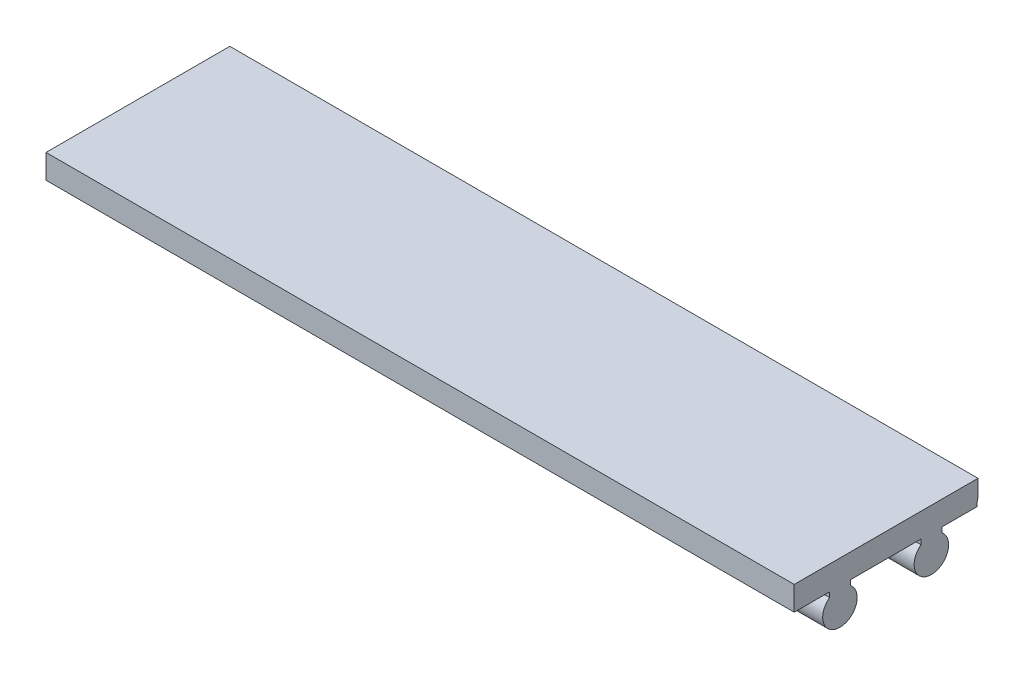
ISO-10303-21;
HEADER;
FILE_DESCRIPTION(('STEP AP214'),'2;1');
FILE_NAME('part.step','',(''),(''),'','','');
FILE_SCHEMA(('AUTOMOTIVE_DESIGN { 1 0 10303 214 1 1 1 1 }'));
ENDSEC;
DATA;
#1=APPLICATION_CONTEXT('core data for automotive mechanical design processes');
#2=APPLICATION_PROTOCOL_DEFINITION('international standard','automotive_design',2000,#1);
#3=PRODUCT_CONTEXT('',#1,'mechanical');
#4=PRODUCT('Part','Part','',(#3));
#5=PRODUCT_RELATED_PRODUCT_CATEGORY('part','',(#4));
#6=PRODUCT_DEFINITION_FORMATION('','',#4);
#7=PRODUCT_DEFINITION_CONTEXT('part definition',#1,'design');
#8=PRODUCT_DEFINITION('design','',#6,#7);
#9=PRODUCT_DEFINITION_SHAPE('','',#8);
#10=(LENGTH_UNIT() NAMED_UNIT(*) SI_UNIT(.MILLI.,.METRE.));
#11=(NAMED_UNIT(*) PLANE_ANGLE_UNIT() SI_UNIT($,.RADIAN.));
#12=(NAMED_UNIT(*) SI_UNIT($,.STERADIAN.) SOLID_ANGLE_UNIT());
#13=UNCERTAINTY_MEASURE_WITH_UNIT(LENGTH_MEASURE(1.E-05),#10,'distance_accuracy_value','');
#14=(GEOMETRIC_REPRESENTATION_CONTEXT(3) GLOBAL_UNCERTAINTY_ASSIGNED_CONTEXT((#13)) GLOBAL_UNIT_ASSIGNED_CONTEXT((#10,
#11,#12)) REPRESENTATION_CONTEXT('',''));
#15=CARTESIAN_POINT('',(0.,0.,0.));
#16=DIRECTION('',(0.,0.,1.));
#17=DIRECTION('',(1.,0.,0.));
#18=AXIS2_PLACEMENT_3D('',#15,#16,#17);
#19=CARTESIAN_POINT('',(0.,-25.7499999999933,-5.49999999999999));
#20=DIRECTION('',(1.,0.,0.));
#21=DIRECTION('',(0.,0.,-1.));
#22=AXIS2_PLACEMENT_3D('',#19,#20,#21);
#23=PLANE('',#22);
#24=DIRECTION('',(0.,-1.,0.));
#25=VECTOR('',#24,1.);
#26=CARTESIAN_POINT('',(0.,-19.2499999999933,11.));
#27=LINE('',#26,#25);
#28=CARTESIAN_POINT('',(0.,-20.6,11.));
#29=VERTEX_POINT('',#28);
#30=CARTESIAN_POINT('',(0.,-23.4999999999933,11.));
#31=VERTEX_POINT('',#30);
#32=EDGE_CURVE('E189',#29,#31,#27,.T.);
#33=ORIENTED_EDGE('',*,*,#32,.F.);
#34=DIRECTION('',(0.,0.,1.));
#35=VECTOR('',#34,1.);
#36=CARTESIAN_POINT('',(0.,-20.6,-11.1085719680622));
#37=LINE('',#36,#35);
#38=CARTESIAN_POINT('',(0.,-20.6,-11.1085719680622));
#39=VERTEX_POINT('',#38);
#40=EDGE_CURVE('E159',#39,#29,#37,.T.);
#41=ORIENTED_EDGE('',*,*,#40,.F.);
#42=DIRECTION('',(0.,-1.,0.));
#43=VECTOR('',#42,1.);
#44=CARTESIAN_POINT('',(0.,-20.6,-11.1085719680622));
#45=LINE('',#44,#43);
#46=CARTESIAN_POINT('',(0.,-22.6,-11.1085719680622));
#47=VERTEX_POINT('',#46);
#48=EDGE_CURVE('E164',#39,#47,#45,.T.);
#49=ORIENTED_EDGE('',*,*,#48,.T.);
#50=CARTESIAN_POINT('',(0.,-23.25,-13.));
#51=DIRECTION('',(1.,0.,0.));
#52=DIRECTION('',(0.,0.,-1.));
#53=AXIS2_PLACEMENT_3D('',#50,#51,#52);
#54=CIRCLE('',#53,2.);
#55=CARTESIAN_POINT('',(0.,-23.25,-11.));
#56=VERTEX_POINT('',#55);
#57=EDGE_CURVE('E244',#47,#56,#54,.T.);
#58=ORIENTED_EDGE('',*,*,#57,.T.);
#59=DIRECTION('',(0.,1.,0.));
#60=VECTOR('',#59,1.);
#61=CARTESIAN_POINT('',(0.,-23.5,-11.));
#62=LINE('',#61,#60);
#63=CARTESIAN_POINT('',(0.,-23.5,-11.));
#64=VERTEX_POINT('',#63);
#65=EDGE_CURVE('E168',#64,#56,#62,.T.);
#66=ORIENTED_EDGE('',*,*,#65,.F.);
#67=DIRECTION('',(0.,0.,1.));
#68=VECTOR('',#67,1.);
#69=CARTESIAN_POINT('',(0.,-23.5,-14.95));
#70=LINE('',#69,#68);
#71=CARTESIAN_POINT('',(0.,-23.5,-6.74999999999999));
#72=VERTEX_POINT('',#71);
#73=EDGE_CURVE('E177',#64,#72,#70,.T.);
#74=ORIENTED_EDGE('',*,*,#73,.T.);
#75=DIRECTION('',(0.,1.,0.));
#76=VECTOR('',#75,1.);
#77=CARTESIAN_POINT('',(0.,-24.0937617924881,-6.74999999999998));
#78=LINE('',#77,#76);
#79=CARTESIAN_POINT('',(0.,-24.0937617924881,-6.74999999999998));
#80=VERTEX_POINT('',#79);
#81=EDGE_CURVE('E185',#80,#72,#78,.T.);
#82=ORIENTED_EDGE('',*,*,#81,.F.);
#83=CARTESIAN_POINT('',(0.,-25.7499999999933,-5.49999999999999));
#84=DIRECTION('',(1.,0.,0.));
#85=DIRECTION('',(0.,0.,-1.));
#86=AXIS2_PLACEMENT_3D('',#83,#84,#85);
#87=CIRCLE('',#86,2.075);
#88=CARTESIAN_POINT('',(0.,-24.0937617924881,-4.24999999999999));
#89=VERTEX_POINT('',#88);
#90=EDGE_CURVE('E182',#89,#80,#87,.T.);
#91=ORIENTED_EDGE('',*,*,#90,.F.);
#92=DIRECTION('',(0.,-1.,0.));
#93=VECTOR('',#92,1.);
#94=CARTESIAN_POINT('',(0.,-23.4999999999933,-4.24999999999999));
#95=LINE('',#94,#93);
#96=CARTESIAN_POINT('',(0.,-23.4999999999933,-4.24999999999999));
#97=VERTEX_POINT('',#96);
#98=EDGE_CURVE('E206',#97,#89,#95,.T.);
#99=ORIENTED_EDGE('',*,*,#98,.F.);
#100=DIRECTION('',(0.,0.,-1.));
#101=VECTOR('',#100,1.);
#102=CARTESIAN_POINT('',(0.,-23.4999999999933,4.25000000000001));
#103=LINE('',#102,#101);
#104=CARTESIAN_POINT('',(0.,-23.4999999999933,4.25000000000001));
#105=VERTEX_POINT('',#104);
#106=EDGE_CURVE('E203',#105,#97,#103,.T.);
#107=ORIENTED_EDGE('',*,*,#106,.F.);
#108=DIRECTION('',(0.,1.,0.));
#109=VECTOR('',#108,1.);
#110=CARTESIAN_POINT('',(0.,-24.0937617924881,4.25000000000001));
#111=LINE('',#110,#109);
#112=CARTESIAN_POINT('',(0.,-24.0937617924881,4.25000000000001));
#113=VERTEX_POINT('',#112);
#114=EDGE_CURVE('E200',#113,#105,#111,.T.);
#115=ORIENTED_EDGE('',*,*,#114,.F.);
#116=CARTESIAN_POINT('',(0.,-25.7499999999933,5.5));
#117=DIRECTION('',(1.,0.,0.));
#118=DIRECTION('',(0.,0.,-1.));
#119=AXIS2_PLACEMENT_3D('',#116,#117,#118);
#120=CIRCLE('',#119,2.075);
#121=CARTESIAN_POINT('',(0.,-24.0937617924881,6.75));
#122=VERTEX_POINT('',#121);
#123=EDGE_CURVE('E197',#122,#113,#120,.T.);
#124=ORIENTED_EDGE('',*,*,#123,.F.);
#125=DIRECTION('',(0.,-1.,0.));
#126=VECTOR('',#125,1.);
#127=CARTESIAN_POINT('',(0.,-23.4999999999933,6.75));
#128=LINE('',#127,#126);
#129=CARTESIAN_POINT('',(0.,-23.4999999999933,6.75));
#130=VERTEX_POINT('',#129);
#131=EDGE_CURVE('E194',#130,#122,#128,.T.);
#132=ORIENTED_EDGE('',*,*,#131,.F.);
#133=DIRECTION('',(0.,0.,-1.));
#134=VECTOR('',#133,1.);
#135=CARTESIAN_POINT('',(0.,-23.4999999999933,11.));
#136=LINE('',#135,#134);
#137=EDGE_CURVE('E191',#31,#130,#136,.T.);
#138=ORIENTED_EDGE('',*,*,#137,.F.);
#139=EDGE_LOOP('',(#33,#41,#49,#58,#66,#74,#82,#91,#99,#107,#115,#124,#132,#138));
#140=FACE_BOUND('',#139,.T.);
#141=ADVANCED_FACE('F33',(#140),#23,.F.);
#142=CARTESIAN_POINT('',(90.,-25.7499999999933,-5.49999999999999));
#143=DIRECTION('',(1.,0.,0.));
#144=DIRECTION('',(0.,0.,-1.));
#145=AXIS2_PLACEMENT_3D('',#142,#143,#144);
#146=PLANE('',#145);
#147=CARTESIAN_POINT('',(90.,-23.25,-13.));
#148=DIRECTION('',(1.,0.,0.));
#149=DIRECTION('',(0.,0.,-1.));
#150=AXIS2_PLACEMENT_3D('',#147,#148,#149);
#151=CIRCLE('',#150,2.);
#152=CARTESIAN_POINT('',(90.,-23.25,-11.));
#153=VERTEX_POINT('',#152);
#154=CARTESIAN_POINT('',(90.,-22.6,-11.1085719680622));
#155=VERTEX_POINT('',#154);
#156=EDGE_CURVE('E41',#153,#155,#151,.F.);
#157=ORIENTED_EDGE('',*,*,#156,.T.);
#158=DIRECTION('',(0.,-1.,0.));
#159=VECTOR('',#158,1.);
#160=CARTESIAN_POINT('',(90.,-20.6,-11.1085719680622));
#161=LINE('',#160,#159);
#162=CARTESIAN_POINT('',(90.,-20.6,-11.1085719680622));
#163=VERTEX_POINT('',#162);
#164=EDGE_CURVE('E151',#163,#155,#161,.T.);
#165=ORIENTED_EDGE('',*,*,#164,.F.);
#166=DIRECTION('',(0.,0.,-1.));
#167=VECTOR('',#166,1.);
#168=CARTESIAN_POINT('',(90.,-20.6,11.));
#169=LINE('',#168,#167);
#170=CARTESIAN_POINT('',(90.,-20.6,11.));
#171=VERTEX_POINT('',#170);
#172=EDGE_CURVE('E148',#171,#163,#169,.T.);
#173=ORIENTED_EDGE('',*,*,#172,.F.);
#174=DIRECTION('',(0.,-1.,0.));
#175=VECTOR('',#174,1.);
#176=CARTESIAN_POINT('',(90.,-19.2499999999933,11.));
#177=LINE('',#176,#175);
#178=CARTESIAN_POINT('',(90.,-23.4999999999933,11.));
#179=VERTEX_POINT('',#178);
#180=EDGE_CURVE('E134',#171,#179,#177,.T.);
#181=ORIENTED_EDGE('',*,*,#180,.T.);
#182=DIRECTION('',(0.,0.,-1.));
#183=VECTOR('',#182,1.);
#184=CARTESIAN_POINT('',(90.,-23.4999999999933,11.));
#185=LINE('',#184,#183);
#186=CARTESIAN_POINT('',(90.,-23.4999999999933,6.75));
#187=VERTEX_POINT('',#186);
#188=EDGE_CURVE('E144',#179,#187,#185,.T.);
#189=ORIENTED_EDGE('',*,*,#188,.T.);
#190=DIRECTION('',(0.,-1.,0.));
#191=VECTOR('',#190,1.);
#192=CARTESIAN_POINT('',(90.,-23.4999999999933,6.75));
#193=LINE('',#192,#191);
#194=CARTESIAN_POINT('',(90.,-24.0937617924881,6.75));
#195=VERTEX_POINT('',#194);
#196=EDGE_CURVE('E215',#187,#195,#193,.T.);
#197=ORIENTED_EDGE('',*,*,#196,.T.);
#198=CARTESIAN_POINT('',(90.,-25.7499999999933,5.5));
#199=DIRECTION('',(1.,0.,0.));
#200=DIRECTION('',(0.,0.,-1.));
#201=AXIS2_PLACEMENT_3D('',#198,#199,#200);
#202=CIRCLE('',#201,2.075);
#203=CARTESIAN_POINT('',(90.,-24.0937617924881,4.25000000000001));
#204=VERTEX_POINT('',#203);
#205=EDGE_CURVE('E218',#195,#204,#202,.T.);
#206=ORIENTED_EDGE('',*,*,#205,.T.);
#207=DIRECTION('',(0.,1.,0.));
#208=VECTOR('',#207,1.);
#209=CARTESIAN_POINT('',(90.,-24.0937617924881,4.25000000000001));
#210=LINE('',#209,#208);
#211=CARTESIAN_POINT('',(90.,-23.4999999999933,4.25000000000001));
#212=VERTEX_POINT('',#211);
#213=EDGE_CURVE('E221',#204,#212,#210,.T.);
#214=ORIENTED_EDGE('',*,*,#213,.T.);
#215=DIRECTION('',(0.,0.,-1.));
#216=VECTOR('',#215,1.);
#217=CARTESIAN_POINT('',(90.,-23.4999999999933,4.25000000000001));
#218=LINE('',#217,#216);
#219=CARTESIAN_POINT('',(90.,-23.4999999999933,-4.24999999999999));
#220=VERTEX_POINT('',#219);
#221=EDGE_CURVE('E224',#212,#220,#218,.T.);
#222=ORIENTED_EDGE('',*,*,#221,.T.);
#223=DIRECTION('',(0.,-1.,0.));
#224=VECTOR('',#223,1.);
#225=CARTESIAN_POINT('',(90.,-23.4999999999933,-4.24999999999999));
#226=LINE('',#225,#224);
#227=CARTESIAN_POINT('',(90.,-24.0937617924881,-4.24999999999999));
#228=VERTEX_POINT('',#227);
#229=EDGE_CURVE('E186',#220,#228,#226,.T.);
#230=ORIENTED_EDGE('',*,*,#229,.T.);
#231=CARTESIAN_POINT('',(90.,-25.7499999999933,-5.49999999999999));
#232=DIRECTION('',(1.,0.,0.));
#233=DIRECTION('',(0.,0.,-1.));
#234=AXIS2_PLACEMENT_3D('',#231,#232,#233);
#235=CIRCLE('',#234,2.075);
#236=CARTESIAN_POINT('',(90.,-24.0937617924881,-6.74999999999998));
#237=VERTEX_POINT('',#236);
#238=EDGE_CURVE('E181',#228,#237,#235,.T.);
#239=ORIENTED_EDGE('',*,*,#238,.T.);
#240=DIRECTION('',(0.,1.,0.));
#241=VECTOR('',#240,1.);
#242=CARTESIAN_POINT('',(90.,-24.0937617924881,-6.74999999999998));
#243=LINE('',#242,#241);
#244=CARTESIAN_POINT('',(90.,-23.5,-6.74999999999999));
#245=VERTEX_POINT('',#244);
#246=EDGE_CURVE('E145',#237,#245,#243,.T.);
#247=ORIENTED_EDGE('',*,*,#246,.T.);
#248=DIRECTION('',(0.,0.,1.));
#249=VECTOR('',#248,1.);
#250=CARTESIAN_POINT('',(90.,-23.5,-14.95));
#251=LINE('',#250,#249);
#252=CARTESIAN_POINT('',(90.,-23.5,-11.));
#253=VERTEX_POINT('',#252);
#254=EDGE_CURVE('E179',#253,#245,#251,.T.);
#255=ORIENTED_EDGE('',*,*,#254,.F.);
#256=DIRECTION('',(0.,1.,0.));
#257=VECTOR('',#256,1.);
#258=CARTESIAN_POINT('',(90.,-23.5,-11.));
#259=LINE('',#258,#257);
#260=EDGE_CURVE('E169',#253,#153,#259,.T.);
#261=ORIENTED_EDGE('',*,*,#260,.T.);
#262=EDGE_LOOP('',(#157,#165,#173,#181,#189,#197,#206,#214,#222,#230,#239,#247,#255,#261));
#263=FACE_BOUND('',#262,.T.);
#264=ADVANCED_FACE('F149',(#263),#146,.T.);
#265=CARTESIAN_POINT('',(0.,-24.0937617924881,-6.74999999999998));
#266=DIRECTION('',(0.,0.,-1.));
#267=DIRECTION('',(-1.,0.,0.));
#268=AXIS2_PLACEMENT_3D('',#265,#266,#267);
#269=PLANE('',#268);
#270=ORIENTED_EDGE('',*,*,#81,.T.);
#271=DIRECTION('',(-1.,0.,0.));
#272=VECTOR('',#271,1.);
#273=CARTESIAN_POINT('',(0.,-23.5,-6.74999999999999));
#274=LINE('',#273,#272);
#275=EDGE_CURVE('E174',#245,#72,#274,.T.);
#276=ORIENTED_EDGE('',*,*,#275,.F.);
#277=ORIENTED_EDGE('',*,*,#246,.F.);
#278=DIRECTION('',(1.,0.,0.));
#279=VECTOR('',#278,1.);
#280=CARTESIAN_POINT('',(0.,-24.0937617924881,-6.74999999999998));
#281=LINE('',#280,#279);
#282=EDGE_CURVE('E209',#80,#237,#281,.T.);
#283=ORIENTED_EDGE('',*,*,#282,.F.);
#284=EDGE_LOOP('',(#270,#276,#277,#283));
#285=FACE_BOUND('',#284,.T.);
#286=ADVANCED_FACE('F278',(#285),#269,.T.);
#287=CARTESIAN_POINT('',(0.,-25.7499999999933,-5.49999999999999));
#288=DIRECTION('',(1.,0.,0.));
#289=DIRECTION('',(0.,0.,-1.));
#290=AXIS2_PLACEMENT_3D('',#287,#288,#289);
#291=CYLINDRICAL_SURFACE('',#290,2.075);
#292=ORIENTED_EDGE('',*,*,#238,.F.);
#293=DIRECTION('',(1.,0.,0.));
#294=VECTOR('',#293,1.);
#295=CARTESIAN_POINT('',(0.,-24.0937617924881,-4.24999999999999));
#296=LINE('',#295,#294);
#297=EDGE_CURVE('E229',#89,#228,#296,.T.);
#298=ORIENTED_EDGE('',*,*,#297,.F.);
#299=ORIENTED_EDGE('',*,*,#90,.T.);
#300=ORIENTED_EDGE('',*,*,#282,.T.);
#301=EDGE_LOOP('',(#292,#298,#299,#300));
#302=FACE_BOUND('',#301,.T.);
#303=ADVANCED_FACE('F274',(#302),#291,.T.);
#304=CARTESIAN_POINT('',(0.,-23.4999999999933,-4.24999999999999));
#305=DIRECTION('',(0.,0.,1.));
#306=DIRECTION('',(1.,0.,0.));
#307=AXIS2_PLACEMENT_3D('',#304,#305,#306);
#308=PLANE('',#307);
#309=ORIENTED_EDGE('',*,*,#229,.F.);
#310=DIRECTION('',(1.,0.,0.));
#311=VECTOR('',#310,1.);
#312=CARTESIAN_POINT('',(0.,-23.4999999999933,-4.24999999999999));
#313=LINE('',#312,#311);
#314=EDGE_CURVE('E231',#97,#220,#313,.T.);
#315=ORIENTED_EDGE('',*,*,#314,.F.);
#316=ORIENTED_EDGE('',*,*,#98,.T.);
#317=ORIENTED_EDGE('',*,*,#297,.T.);
#318=EDGE_LOOP('',(#309,#315,#316,#317));
#319=FACE_BOUND('',#318,.T.);
#320=ADVANCED_FACE('F269',(#319),#308,.T.);
#321=CARTESIAN_POINT('',(0.,-23.4999999999933,4.25000000000001));
#322=DIRECTION('',(0.,-1.,0.));
#323=DIRECTION('',(0.,0.,-1.));
#324=AXIS2_PLACEMENT_3D('',#321,#322,#323);
#325=PLANE('',#324);
#326=ORIENTED_EDGE('',*,*,#221,.F.);
#327=DIRECTION('',(1.,0.,0.));
#328=VECTOR('',#327,1.);
#329=CARTESIAN_POINT('',(0.,-23.4999999999933,4.25000000000001));
#330=LINE('',#329,#328);
#331=EDGE_CURVE('E233',#105,#212,#330,.T.);
#332=ORIENTED_EDGE('',*,*,#331,.F.);
#333=ORIENTED_EDGE('',*,*,#106,.T.);
#334=ORIENTED_EDGE('',*,*,#314,.T.);
#335=EDGE_LOOP('',(#326,#332,#333,#334));
#336=FACE_BOUND('',#335,.T.);
#337=ADVANCED_FACE('F303',(#336),#325,.T.);
#338=CARTESIAN_POINT('',(0.,-24.0937617924881,4.25000000000001));
#339=DIRECTION('',(0.,0.,-1.));
#340=DIRECTION('',(-1.,0.,0.));
#341=AXIS2_PLACEMENT_3D('',#338,#339,#340);
#342=PLANE('',#341);
#343=ORIENTED_EDGE('',*,*,#213,.F.);
#344=DIRECTION('',(1.,0.,0.));
#345=VECTOR('',#344,1.);
#346=CARTESIAN_POINT('',(0.,-24.0937617924881,4.25000000000001));
#347=LINE('',#346,#345);
#348=EDGE_CURVE('E235',#113,#204,#347,.T.);
#349=ORIENTED_EDGE('',*,*,#348,.F.);
#350=ORIENTED_EDGE('',*,*,#114,.T.);
#351=ORIENTED_EDGE('',*,*,#331,.T.);
#352=EDGE_LOOP('',(#343,#349,#350,#351));
#353=FACE_BOUND('',#352,.T.);
#354=ADVANCED_FACE('F264',(#353),#342,.T.);
#355=CARTESIAN_POINT('',(0.,-25.7499999999933,5.5));
#356=DIRECTION('',(1.,0.,0.));
#357=DIRECTION('',(0.,0.,-1.));
#358=AXIS2_PLACEMENT_3D('',#355,#356,#357);
#359=CYLINDRICAL_SURFACE('',#358,2.075);
#360=ORIENTED_EDGE('',*,*,#205,.F.);
#361=DIRECTION('',(1.,0.,0.));
#362=VECTOR('',#361,1.);
#363=CARTESIAN_POINT('',(0.,-24.0937617924881,6.75));
#364=LINE('',#363,#362);
#365=EDGE_CURVE('E237',#122,#195,#364,.T.);
#366=ORIENTED_EDGE('',*,*,#365,.F.);
#367=ORIENTED_EDGE('',*,*,#123,.T.);
#368=ORIENTED_EDGE('',*,*,#348,.T.);
#369=EDGE_LOOP('',(#360,#366,#367,#368));
#370=FACE_BOUND('',#369,.T.);
#371=ADVANCED_FACE('F260',(#370),#359,.T.);
#372=CARTESIAN_POINT('',(0.,-23.4999999999933,6.75));
#373=DIRECTION('',(0.,0.,1.));
#374=DIRECTION('',(1.,0.,0.));
#375=AXIS2_PLACEMENT_3D('',#372,#373,#374);
#376=PLANE('',#375);
#377=ORIENTED_EDGE('',*,*,#196,.F.);
#378=DIRECTION('',(1.,0.,0.));
#379=VECTOR('',#378,1.);
#380=CARTESIAN_POINT('',(0.,-23.4999999999933,6.75));
#381=LINE('',#380,#379);
#382=EDGE_CURVE('E239',#130,#187,#381,.T.);
#383=ORIENTED_EDGE('',*,*,#382,.F.);
#384=ORIENTED_EDGE('',*,*,#131,.T.);
#385=ORIENTED_EDGE('',*,*,#365,.T.);
#386=EDGE_LOOP('',(#377,#383,#384,#385));
#387=FACE_BOUND('',#386,.T.);
#388=ADVANCED_FACE('F257',(#387),#376,.T.);
#389=CARTESIAN_POINT('',(0.,-23.4999999999933,11.));
#390=DIRECTION('',(0.,-1.,0.));
#391=DIRECTION('',(0.,0.,-1.));
#392=AXIS2_PLACEMENT_3D('',#389,#390,#391);
#393=PLANE('',#392);
#394=ORIENTED_EDGE('',*,*,#188,.F.);
#395=DIRECTION('',(1.,0.,0.));
#396=VECTOR('',#395,1.);
#397=CARTESIAN_POINT('',(0.,-23.4999999999933,11.));
#398=LINE('',#397,#396);
#399=EDGE_CURVE('E140',#31,#179,#398,.T.);
#400=ORIENTED_EDGE('',*,*,#399,.F.);
#401=ORIENTED_EDGE('',*,*,#137,.T.);
#402=ORIENTED_EDGE('',*,*,#382,.T.);
#403=EDGE_LOOP('',(#394,#400,#401,#402));
#404=FACE_BOUND('',#403,.T.);
#405=ADVANCED_FACE('F253',(#404),#393,.T.);
#406=CARTESIAN_POINT('',(0.,-19.2499999999933,11.));
#407=DIRECTION('',(0.,0.,1.));
#408=DIRECTION('',(1.,0.,0.));
#409=AXIS2_PLACEMENT_3D('',#406,#407,#408);
#410=PLANE('',#409);
#411=ORIENTED_EDGE('',*,*,#180,.F.);
#412=DIRECTION('',(1.,0.,0.));
#413=VECTOR('',#412,1.);
#414=CARTESIAN_POINT('',(0.,-20.6,11.));
#415=LINE('',#414,#413);
#416=EDGE_CURVE('E138',#29,#171,#415,.T.);
#417=ORIENTED_EDGE('',*,*,#416,.F.);
#418=ORIENTED_EDGE('',*,*,#32,.T.);
#419=ORIENTED_EDGE('',*,*,#399,.T.);
#420=EDGE_LOOP('',(#411,#417,#418,#419));
#421=FACE_BOUND('',#420,.T.);
#422=ADVANCED_FACE('F136',(#421),#410,.T.);
#423=CARTESIAN_POINT('',(0.,-23.5,-14.95));
#424=DIRECTION('',(0.,1.,0.));
#425=DIRECTION('',(0.,0.,1.));
#426=AXIS2_PLACEMENT_3D('',#423,#424,#425);
#427=PLANE('',#426);
#428=ORIENTED_EDGE('',*,*,#73,.F.);
#429=DIRECTION('',(-1.,0.,0.));
#430=VECTOR('',#429,1.);
#431=CARTESIAN_POINT('',(90.,-23.5,-11.));
#432=LINE('',#431,#430);
#433=EDGE_CURVE('E171',#253,#64,#432,.T.);
#434=ORIENTED_EDGE('',*,*,#433,.F.);
#435=ORIENTED_EDGE('',*,*,#254,.T.);
#436=ORIENTED_EDGE('',*,*,#275,.T.);
#437=EDGE_LOOP('',(#428,#434,#435,#436));
#438=FACE_BOUND('',#437,.T.);
#439=ADVANCED_FACE('F282',(#438),#427,.F.);
#440=CARTESIAN_POINT('',(90.,-23.5,-11.));
#441=DIRECTION('',(0.,0.,1.));
#442=DIRECTION('',(0.,-1.,0.));
#443=AXIS2_PLACEMENT_3D('',#440,#441,#442);
#444=PLANE('',#443);
#445=ORIENTED_EDGE('',*,*,#65,.T.);
#446=DIRECTION('',(-1.,0.,0.));
#447=VECTOR('',#446,1.);
#448=CARTESIAN_POINT('',(90.,-23.25,-11.));
#449=LINE('',#448,#447);
#450=EDGE_CURVE('E54',#56,#153,#449,.F.);
#451=ORIENTED_EDGE('',*,*,#450,.T.);
#452=ORIENTED_EDGE('',*,*,#260,.F.);
#453=ORIENTED_EDGE('',*,*,#433,.T.);
#454=EDGE_LOOP('',(#445,#451,#452,#453));
#455=FACE_BOUND('',#454,.T.);
#456=ADVANCED_FACE('F285',(#455),#444,.F.);
#457=CARTESIAN_POINT('',(90.,-23.25,-13.));
#458=DIRECTION('',(1.,0.,0.));
#459=DIRECTION('',(0.,0.,-1.));
#460=AXIS2_PLACEMENT_3D('',#457,#458,#459);
#461=CYLINDRICAL_SURFACE('',#460,2.);
#462=ORIENTED_EDGE('',*,*,#57,.F.);
#463=DIRECTION('',(1.,0.,0.));
#464=VECTOR('',#463,1.);
#465=CARTESIAN_POINT('',(90.,-22.6,-11.1085719680622));
#466=LINE('',#465,#464);
#467=EDGE_CURVE('E11',#47,#155,#466,.T.);
#468=ORIENTED_EDGE('',*,*,#467,.T.);
#469=ORIENTED_EDGE('',*,*,#156,.F.);
#470=ORIENTED_EDGE('',*,*,#450,.F.);
#471=EDGE_LOOP('',(#462,#468,#469,#470));
#472=FACE_BOUND('',#471,.T.);
#473=ADVANCED_FACE('F35',(#472),#461,.F.);
#474=CARTESIAN_POINT('',(90.,-20.6,-11.1085719680622));
#475=DIRECTION('',(0.,0.,1.));
#476=DIRECTION('',(1.,0.,0.));
#477=AXIS2_PLACEMENT_3D('',#474,#475,#476);
#478=PLANE('',#477);
#479=ORIENTED_EDGE('',*,*,#467,.F.);
#480=ORIENTED_EDGE('',*,*,#48,.F.);
#481=DIRECTION('',(-1.,0.,0.));
#482=VECTOR('',#481,1.);
#483=CARTESIAN_POINT('',(90.,-20.6,-11.1085719680622));
#484=LINE('',#483,#482);
#485=EDGE_CURVE('E154',#163,#39,#484,.T.);
#486=ORIENTED_EDGE('',*,*,#485,.F.);
#487=ORIENTED_EDGE('',*,*,#164,.T.);
#488=EDGE_LOOP('',(#479,#480,#486,#487));
#489=FACE_BOUND('',#488,.T.);
#490=ADVANCED_FACE('F247',(#489),#478,.F.);
#491=CARTESIAN_POINT('',(0.,-20.6,0.));
#492=DIRECTION('',(0.,1.,0.));
#493=DIRECTION('',(0.,0.,1.));
#494=AXIS2_PLACEMENT_3D('',#491,#492,#493);
#495=PLANE('',#494);
#496=ORIENTED_EDGE('',*,*,#416,.T.);
#497=ORIENTED_EDGE('',*,*,#172,.T.);
#498=ORIENTED_EDGE('',*,*,#485,.T.);
#499=ORIENTED_EDGE('',*,*,#40,.T.);
#500=EDGE_LOOP('',(#496,#497,#498,#499));
#501=FACE_BOUND('',#500,.T.);
#502=ADVANCED_FACE('F157',(#501),#495,.T.);
#503=CLOSED_SHELL('',(#141,#264,#286,#303,#320,#337,#354,#371,#388,#405,#422,#439,#456,#473,
#490,#502));
#504=MANIFOLD_SOLID_BREP('B2',#503);
#505=ADVANCED_BREP_SHAPE_REPRESENTATION('',(#18,#504),#14);
#506=SHAPE_DEFINITION_REPRESENTATION(#9,#505);
ENDSEC;
END-ISO-10303-21;
